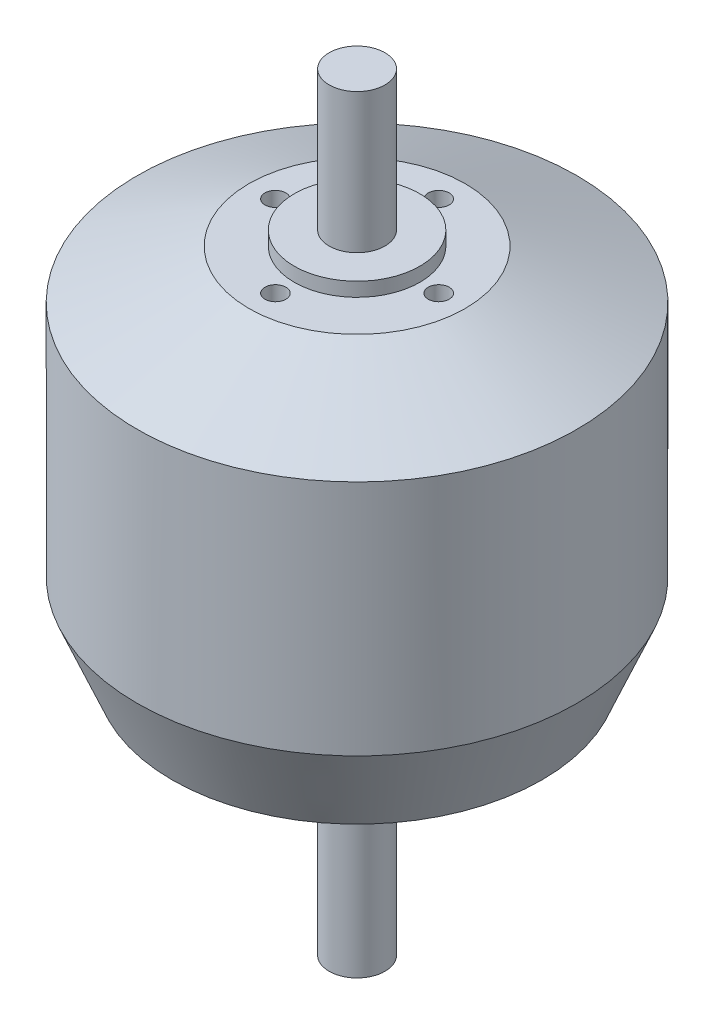
ISO-10303-21;
HEADER;
FILE_DESCRIPTION(('STEP AP214'),'2;1');
FILE_NAME('part.step','',(''),(''),'','','');
FILE_SCHEMA(('AUTOMOTIVE_DESIGN { 1 0 10303 214 1 1 1 1 }'));
ENDSEC;
DATA;
#1=APPLICATION_CONTEXT('core data for automotive mechanical design processes');
#2=APPLICATION_PROTOCOL_DEFINITION('international standard','automotive_design',2000,#1);
#3=PRODUCT_CONTEXT('',#1,'mechanical');
#4=PRODUCT('Part','Part','',(#3));
#5=PRODUCT_RELATED_PRODUCT_CATEGORY('part','',(#4));
#6=PRODUCT_DEFINITION_FORMATION('','',#4);
#7=PRODUCT_DEFINITION_CONTEXT('part definition',#1,'design');
#8=PRODUCT_DEFINITION('design','',#6,#7);
#9=PRODUCT_DEFINITION_SHAPE('','',#8);
#10=(LENGTH_UNIT() NAMED_UNIT(*) SI_UNIT(.MILLI.,.METRE.));
#11=(NAMED_UNIT(*) PLANE_ANGLE_UNIT() SI_UNIT($,.RADIAN.));
#12=(NAMED_UNIT(*) SI_UNIT($,.STERADIAN.) SOLID_ANGLE_UNIT());
#13=UNCERTAINTY_MEASURE_WITH_UNIT(LENGTH_MEASURE(1.E-05),#10,'distance_accuracy_value','');
#14=(GEOMETRIC_REPRESENTATION_CONTEXT(3) GLOBAL_UNCERTAINTY_ASSIGNED_CONTEXT((#13)) GLOBAL_UNIT_ASSIGNED_CONTEXT((#10,
#11,#12)) REPRESENTATION_CONTEXT('',''));
#15=CARTESIAN_POINT('',(0.,0.,0.));
#16=DIRECTION('',(0.,0.,1.));
#17=DIRECTION('',(1.,0.,0.));
#18=AXIS2_PLACEMENT_3D('',#15,#16,#17);
#19=CARTESIAN_POINT('',(0.,55.,0.));
#20=DIRECTION('',(0.,-1.,0.));
#21=DIRECTION('',(0.,0.,-1.));
#22=AXIS2_PLACEMENT_3D('',#19,#20,#21);
#23=CYLINDRICAL_SURFACE('',#22,31.5);
#24=CARTESIAN_POINT('',(0.,46.,0.));
#25=DIRECTION('',(0.,1.,0.));
#26=DIRECTION('',(0.,0.,1.));
#27=AXIS2_PLACEMENT_3D('',#24,#25,#26);
#28=CIRCLE('',#27,31.5);
#29=CARTESIAN_POINT('',(0.,46.,-31.5));
#30=VERTEX_POINT('',#29);
#31=EDGE_CURVE('E45',#30,#30,#28,.F.);
#32=ORIENTED_EDGE('',*,*,#31,.T.);
#33=EDGE_LOOP('',(#32));
#34=FACE_BOUND('',#33,.T.);
#35=CARTESIAN_POINT('',(0.,12.,0.));
#36=DIRECTION('',(0.,1.,0.));
#37=DIRECTION('',(0.,0.,1.));
#38=AXIS2_PLACEMENT_3D('',#35,#36,#37);
#39=CIRCLE('',#38,31.5);
#40=CARTESIAN_POINT('',(0.,12.,31.5));
#41=VERTEX_POINT('',#40);
#42=EDGE_CURVE('E115',#41,#41,#39,.T.);
#43=ORIENTED_EDGE('',*,*,#42,.T.);
#44=EDGE_LOOP('',(#43));
#45=FACE_BOUND('',#44,.T.);
#46=ADVANCED_FACE('F41',(#34,#45),#23,.T.);
#47=CARTESIAN_POINT('',(0.,0.,0.));
#48=DIRECTION('',(0.,1.,0.));
#49=DIRECTION('',(0.,0.,1.));
#50=AXIS2_PLACEMENT_3D('',#47,#48,#49);
#51=PLANE('',#50);
#52=CARTESIAN_POINT('',(0.,0.,0.));
#53=DIRECTION('',(0.,1.,0.));
#54=DIRECTION('',(0.,0.,1.));
#55=AXIS2_PLACEMENT_3D('',#52,#53,#54);
#56=CIRCLE('',#55,26.5);
#57=CARTESIAN_POINT('',(0.,0.,26.5));
#58=VERTEX_POINT('',#57);
#59=EDGE_CURVE('E120',#58,#58,#56,.F.);
#60=ORIENTED_EDGE('',*,*,#59,.T.);
#61=EDGE_LOOP('',(#60));
#62=FACE_BOUND('',#61,.T.);
#63=CARTESIAN_POINT('',(0.,0.,22.2));
#64=DIRECTION('',(0.,1.,0.));
#65=DIRECTION('',(0.,0.,1.));
#66=AXIS2_PLACEMENT_3D('',#63,#64,#65);
#67=CIRCLE('',#66,2.);
#68=CARTESIAN_POINT('',(0.,0.,24.2));
#69=VERTEX_POINT('',#68);
#70=EDGE_CURVE('E86',#69,#69,#67,.T.);
#71=ORIENTED_EDGE('',*,*,#70,.T.);
#72=EDGE_LOOP('',(#71));
#73=FACE_BOUND('',#72,.T.);
#74=CARTESIAN_POINT('',(-22.2,0.,0.));
#75=DIRECTION('',(0.,1.,0.));
#76=DIRECTION('',(0.,0.,1.));
#77=AXIS2_PLACEMENT_3D('',#74,#75,#76);
#78=CIRCLE('',#77,2.);
#79=CARTESIAN_POINT('',(-22.2,0.,2.));
#80=VERTEX_POINT('',#79);
#81=EDGE_CURVE('E92',#80,#80,#78,.T.);
#82=ORIENTED_EDGE('',*,*,#81,.T.);
#83=EDGE_LOOP('',(#82));
#84=FACE_BOUND('',#83,.T.);
#85=CARTESIAN_POINT('',(0.,0.,-22.2));
#86=DIRECTION('',(0.,1.,0.));
#87=DIRECTION('',(0.,0.,1.));
#88=AXIS2_PLACEMENT_3D('',#85,#86,#87);
#89=CIRCLE('',#88,2.);
#90=CARTESIAN_POINT('',(0.,0.,-20.2));
#91=VERTEX_POINT('',#90);
#92=EDGE_CURVE('E98',#91,#91,#89,.T.);
#93=ORIENTED_EDGE('',*,*,#92,.T.);
#94=EDGE_LOOP('',(#93));
#95=FACE_BOUND('',#94,.T.);
#96=CARTESIAN_POINT('',(22.2,0.,0.));
#97=DIRECTION('',(0.,1.,0.));
#98=DIRECTION('',(0.,0.,1.));
#99=AXIS2_PLACEMENT_3D('',#96,#97,#98);
#100=CIRCLE('',#99,2.);
#101=CARTESIAN_POINT('',(22.2,0.,2.));
#102=VERTEX_POINT('',#101);
#103=EDGE_CURVE('E60',#102,#102,#100,.T.);
#104=ORIENTED_EDGE('',*,*,#103,.T.);
#105=EDGE_LOOP('',(#104));
#106=FACE_BOUND('',#105,.T.);
#107=CARTESIAN_POINT('',(0.,0.,0.));
#108=DIRECTION('',(0.,1.,0.));
#109=DIRECTION('',(0.,0.,1.));
#110=AXIS2_PLACEMENT_3D('',#107,#108,#109);
#111=CIRCLE('',#110,4.);
#112=CARTESIAN_POINT('',(0.,0.,4.));
#113=VERTEX_POINT('',#112);
#114=EDGE_CURVE('E85',#113,#113,#111,.T.);
#115=ORIENTED_EDGE('',*,*,#114,.T.);
#116=EDGE_LOOP('',(#115));
#117=FACE_BOUND('',#116,.T.);
#118=ADVANCED_FACE('F143',(#62,#73,#84,#95,#106,#117),#51,.F.);
#119=CARTESIAN_POINT('',(0.,53.,0.));
#120=DIRECTION('',(0.,1.,0.));
#121=DIRECTION('',(0.,0.,1.));
#122=AXIS2_PLACEMENT_3D('',#119,#120,#121);
#123=PLANE('',#122);
#124=CARTESIAN_POINT('',(0.,53.,0.));
#125=DIRECTION('',(0.,1.,0.));
#126=DIRECTION('',(0.,0.,1.));
#127=AXIS2_PLACEMENT_3D('',#124,#125,#126);
#128=CIRCLE('',#127,15.4999999999998);
#129=CARTESIAN_POINT('',(0.,53.,-15.4999999999999));
#130=VERTEX_POINT('',#129);
#131=EDGE_CURVE('E53',#130,#130,#128,.T.);
#132=ORIENTED_EDGE('',*,*,#131,.T.);
#133=EDGE_LOOP('',(#132));
#134=FACE_BOUND('',#133,.T.);
#135=CARTESIAN_POINT('',(-11.7,53.,0.));
#136=DIRECTION('',(0.,1.,0.));
#137=DIRECTION('',(0.,0.,1.));
#138=AXIS2_PLACEMENT_3D('',#135,#136,#137);
#139=CIRCLE('',#138,1.5);
#140=CARTESIAN_POINT('',(-11.7,53.,1.5));
#141=VERTEX_POINT('',#140);
#142=EDGE_CURVE('E61',#141,#141,#139,.T.);
#143=ORIENTED_EDGE('',*,*,#142,.F.);
#144=EDGE_LOOP('',(#143));
#145=FACE_BOUND('',#144,.T.);
#146=CARTESIAN_POINT('',(0.,53.,-11.7));
#147=DIRECTION('',(0.,1.,0.));
#148=DIRECTION('',(0.,0.,1.));
#149=AXIS2_PLACEMENT_3D('',#146,#147,#148);
#150=CIRCLE('',#149,1.5);
#151=CARTESIAN_POINT('',(0.,53.,-10.2));
#152=VERTEX_POINT('',#151);
#153=EDGE_CURVE('E67',#152,#152,#150,.T.);
#154=ORIENTED_EDGE('',*,*,#153,.F.);
#155=EDGE_LOOP('',(#154));
#156=FACE_BOUND('',#155,.T.);
#157=CARTESIAN_POINT('',(11.7,53.,0.));
#158=DIRECTION('',(0.,1.,0.));
#159=DIRECTION('',(0.,0.,1.));
#160=AXIS2_PLACEMENT_3D('',#157,#158,#159);
#161=CIRCLE('',#160,1.5);
#162=CARTESIAN_POINT('',(11.7,53.,1.5));
#163=VERTEX_POINT('',#162);
#164=EDGE_CURVE('E73',#163,#163,#161,.T.);
#165=ORIENTED_EDGE('',*,*,#164,.F.);
#166=EDGE_LOOP('',(#165));
#167=FACE_BOUND('',#166,.T.);
#168=CARTESIAN_POINT('',(0.,53.,11.7));
#169=DIRECTION('',(0.,1.,0.));
#170=DIRECTION('',(0.,0.,1.));
#171=AXIS2_PLACEMENT_3D('',#168,#169,#170);
#172=CIRCLE('',#171,1.5);
#173=CARTESIAN_POINT('',(0.,53.,13.2));
#174=VERTEX_POINT('',#173);
#175=EDGE_CURVE('E79',#174,#174,#172,.T.);
#176=ORIENTED_EDGE('',*,*,#175,.F.);
#177=EDGE_LOOP('',(#176));
#178=FACE_BOUND('',#177,.T.);
#179=CARTESIAN_POINT('',(0.,53.,0.));
#180=DIRECTION('',(0.,1.,0.));
#181=DIRECTION('',(0.,0.,1.));
#182=AXIS2_PLACEMENT_3D('',#179,#180,#181);
#183=CIRCLE('',#182,9.);
#184=CARTESIAN_POINT('',(0.,53.,9.));
#185=VERTEX_POINT('',#184);
#186=EDGE_CURVE('E112',#185,#185,#183,.T.);
#187=ORIENTED_EDGE('',*,*,#186,.F.);
#188=EDGE_LOOP('',(#187));
#189=FACE_BOUND('',#188,.T.);
#190=ADVANCED_FACE('F125',(#134,#145,#156,#167,#178,#189),#123,.T.);
#191=CARTESIAN_POINT('',(0.,53.,0.));
#192=DIRECTION('',(0.,1.,0.));
#193=DIRECTION('',(0.,0.,1.));
#194=AXIS2_PLACEMENT_3D('',#191,#192,#193);
#195=CYLINDRICAL_SURFACE('',#194,9.);
#196=ORIENTED_EDGE('',*,*,#186,.T.);
#197=EDGE_LOOP('',(#196));
#198=FACE_BOUND('',#197,.T.);
#199=CARTESIAN_POINT('',(0.,55.,0.));
#200=DIRECTION('',(0.,1.,0.));
#201=DIRECTION('',(0.,0.,1.));
#202=AXIS2_PLACEMENT_3D('',#199,#200,#201);
#203=CIRCLE('',#202,9.);
#204=CARTESIAN_POINT('',(0.,55.,9.));
#205=VERTEX_POINT('',#204);
#206=EDGE_CURVE('E109',#205,#205,#203,.T.);
#207=ORIENTED_EDGE('',*,*,#206,.F.);
#208=EDGE_LOOP('',(#207));
#209=FACE_BOUND('',#208,.T.);
#210=ADVANCED_FACE('F157',(#198,#209),#195,.T.);
#211=CARTESIAN_POINT('',(0.,55.,0.));
#212=DIRECTION('',(0.,1.,0.));
#213=DIRECTION('',(0.,0.,1.));
#214=AXIS2_PLACEMENT_3D('',#211,#212,#213);
#215=PLANE('',#214);
#216=CARTESIAN_POINT('',(0.,55.,0.));
#217=DIRECTION('',(0.,1.,0.));
#218=DIRECTION('',(0.,0.,1.));
#219=AXIS2_PLACEMENT_3D('',#216,#217,#218);
#220=CIRCLE('',#219,4.);
#221=CARTESIAN_POINT('',(0.,55.,4.));
#222=VERTEX_POINT('',#221);
#223=EDGE_CURVE('E11',#222,#222,#220,.T.);
#224=ORIENTED_EDGE('',*,*,#223,.F.);
#225=EDGE_LOOP('',(#224));
#226=FACE_BOUND('',#225,.T.);
#227=ORIENTED_EDGE('',*,*,#206,.T.);
#228=EDGE_LOOP('',(#227));
#229=FACE_BOUND('',#228,.T.);
#230=ADVANCED_FACE('F153',(#226,#229),#215,.T.);
#231=CARTESIAN_POINT('',(0.,-35.,0.));
#232=DIRECTION('',(0.,1.,0.));
#233=DIRECTION('',(0.,0.,1.));
#234=AXIS2_PLACEMENT_3D('',#231,#232,#233);
#235=CYLINDRICAL_SURFACE('',#234,4.);
#236=CARTESIAN_POINT('',(0.,-35.,0.));
#237=DIRECTION('',(0.,1.,0.));
#238=DIRECTION('',(0.,0.,1.));
#239=AXIS2_PLACEMENT_3D('',#236,#237,#238);
#240=CIRCLE('',#239,4.);
#241=CARTESIAN_POINT('',(0.,-35.,4.));
#242=VERTEX_POINT('',#241);
#243=EDGE_CURVE('E106',#242,#242,#240,.T.);
#244=ORIENTED_EDGE('',*,*,#243,.T.);
#245=EDGE_LOOP('',(#244));
#246=FACE_BOUND('',#245,.T.);
#247=ORIENTED_EDGE('',*,*,#114,.F.);
#248=EDGE_LOOP('',(#247));
#249=FACE_BOUND('',#248,.T.);
#250=ADVANCED_FACE('F156',(#246,#249),#235,.T.);
#251=CARTESIAN_POINT('',(0.,-35.,0.));
#252=DIRECTION('',(0.,1.,0.));
#253=DIRECTION('',(0.,0.,1.));
#254=AXIS2_PLACEMENT_3D('',#251,#252,#253);
#255=PLANE('',#254);
#256=ORIENTED_EDGE('',*,*,#243,.F.);
#257=EDGE_LOOP('',(#256));
#258=FACE_BOUND('',#257,.T.);
#259=ADVANCED_FACE('F166',(#258),#255,.F.);
#260=CARTESIAN_POINT('',(22.2,10.,0.));
#261=DIRECTION('',(0.,-1.,0.));
#262=DIRECTION('',(0.,0.,-1.));
#263=AXIS2_PLACEMENT_3D('',#260,#261,#262);
#264=CYLINDRICAL_SURFACE('',#263,2.);
#265=CARTESIAN_POINT('',(22.2,10.,0.));
#266=DIRECTION('',(0.,1.,0.));
#267=DIRECTION('',(0.,0.,1.));
#268=AXIS2_PLACEMENT_3D('',#265,#266,#267);
#269=CIRCLE('',#268,2.);
#270=CARTESIAN_POINT('',(22.2,10.,2.));
#271=VERTEX_POINT('',#270);
#272=EDGE_CURVE('E101',#271,#271,#269,.T.);
#273=ORIENTED_EDGE('',*,*,#272,.T.);
#274=EDGE_LOOP('',(#273));
#275=FACE_BOUND('',#274,.T.);
#276=ORIENTED_EDGE('',*,*,#103,.F.);
#277=EDGE_LOOP('',(#276));
#278=FACE_BOUND('',#277,.T.);
#279=ADVANCED_FACE('F170',(#275,#278),#264,.F.);
#280=CARTESIAN_POINT('',(0.,10.,0.));
#281=DIRECTION('',(0.,1.,0.));
#282=DIRECTION('',(0.,0.,1.));
#283=AXIS2_PLACEMENT_3D('',#280,#281,#282);
#284=PLANE('',#283);
#285=ORIENTED_EDGE('',*,*,#272,.F.);
#286=EDGE_LOOP('',(#285));
#287=FACE_BOUND('',#286,.T.);
#288=ADVANCED_FACE('F174',(#287),#284,.F.);
#289=CARTESIAN_POINT('',(0.,10.,-22.2));
#290=DIRECTION('',(0.,-1.,0.));
#291=DIRECTION('',(0.,0.,-1.));
#292=AXIS2_PLACEMENT_3D('',#289,#290,#291);
#293=CYLINDRICAL_SURFACE('',#292,2.);
#294=CARTESIAN_POINT('',(0.,10.,-22.2));
#295=DIRECTION('',(0.,1.,0.));
#296=DIRECTION('',(0.,0.,1.));
#297=AXIS2_PLACEMENT_3D('',#294,#295,#296);
#298=CIRCLE('',#297,2.);
#299=CARTESIAN_POINT('',(0.,10.,-20.2));
#300=VERTEX_POINT('',#299);
#301=EDGE_CURVE('E95',#300,#300,#298,.T.);
#302=ORIENTED_EDGE('',*,*,#301,.T.);
#303=EDGE_LOOP('',(#302));
#304=FACE_BOUND('',#303,.T.);
#305=ORIENTED_EDGE('',*,*,#92,.F.);
#306=EDGE_LOOP('',(#305));
#307=FACE_BOUND('',#306,.T.);
#308=ADVANCED_FACE('F178',(#304,#307),#293,.F.);
#309=CARTESIAN_POINT('',(0.,10.,0.));
#310=DIRECTION('',(0.,1.,0.));
#311=DIRECTION('',(0.,0.,1.));
#312=AXIS2_PLACEMENT_3D('',#309,#310,#311);
#313=PLANE('',#312);
#314=ORIENTED_EDGE('',*,*,#301,.F.);
#315=EDGE_LOOP('',(#314));
#316=FACE_BOUND('',#315,.T.);
#317=ADVANCED_FACE('F182',(#316),#313,.F.);
#318=CARTESIAN_POINT('',(-22.2,10.,0.));
#319=DIRECTION('',(0.,-1.,0.));
#320=DIRECTION('',(0.,0.,-1.));
#321=AXIS2_PLACEMENT_3D('',#318,#319,#320);
#322=CYLINDRICAL_SURFACE('',#321,2.);
#323=CARTESIAN_POINT('',(-22.2,10.,0.));
#324=DIRECTION('',(0.,1.,0.));
#325=DIRECTION('',(0.,0.,1.));
#326=AXIS2_PLACEMENT_3D('',#323,#324,#325);
#327=CIRCLE('',#326,2.);
#328=CARTESIAN_POINT('',(-22.2,10.,2.));
#329=VERTEX_POINT('',#328);
#330=EDGE_CURVE('E89',#329,#329,#327,.T.);
#331=ORIENTED_EDGE('',*,*,#330,.T.);
#332=EDGE_LOOP('',(#331));
#333=FACE_BOUND('',#332,.T.);
#334=ORIENTED_EDGE('',*,*,#81,.F.);
#335=EDGE_LOOP('',(#334));
#336=FACE_BOUND('',#335,.T.);
#337=ADVANCED_FACE('F186',(#333,#336),#322,.F.);
#338=CARTESIAN_POINT('',(0.,10.,0.));
#339=DIRECTION('',(0.,1.,0.));
#340=DIRECTION('',(0.,0.,1.));
#341=AXIS2_PLACEMENT_3D('',#338,#339,#340);
#342=PLANE('',#341);
#343=ORIENTED_EDGE('',*,*,#330,.F.);
#344=EDGE_LOOP('',(#343));
#345=FACE_BOUND('',#344,.T.);
#346=ADVANCED_FACE('F190',(#345),#342,.F.);
#347=CARTESIAN_POINT('',(0.,10.,22.2));
#348=DIRECTION('',(0.,-1.,0.));
#349=DIRECTION('',(0.,0.,-1.));
#350=AXIS2_PLACEMENT_3D('',#347,#348,#349);
#351=CYLINDRICAL_SURFACE('',#350,2.);
#352=CARTESIAN_POINT('',(0.,10.,22.2));
#353=DIRECTION('',(0.,1.,0.));
#354=DIRECTION('',(0.,0.,1.));
#355=AXIS2_PLACEMENT_3D('',#352,#353,#354);
#356=CIRCLE('',#355,2.);
#357=CARTESIAN_POINT('',(0.,10.,24.2));
#358=VERTEX_POINT('',#357);
#359=EDGE_CURVE('E82',#358,#358,#356,.T.);
#360=ORIENTED_EDGE('',*,*,#359,.T.);
#361=EDGE_LOOP('',(#360));
#362=FACE_BOUND('',#361,.T.);
#363=ORIENTED_EDGE('',*,*,#70,.F.);
#364=EDGE_LOOP('',(#363));
#365=FACE_BOUND('',#364,.T.);
#366=ADVANCED_FACE('F194',(#362,#365),#351,.F.);
#367=CARTESIAN_POINT('',(0.,10.,0.));
#368=DIRECTION('',(0.,1.,0.));
#369=DIRECTION('',(0.,0.,1.));
#370=AXIS2_PLACEMENT_3D('',#367,#368,#369);
#371=PLANE('',#370);
#372=ORIENTED_EDGE('',*,*,#359,.F.);
#373=EDGE_LOOP('',(#372));
#374=FACE_BOUND('',#373,.T.);
#375=ADVANCED_FACE('F198',(#374),#371,.F.);
#376=CARTESIAN_POINT('',(0.,48.,11.7));
#377=DIRECTION('',(0.,1.,0.));
#378=DIRECTION('',(0.,0.,1.));
#379=AXIS2_PLACEMENT_3D('',#376,#377,#378);
#380=CYLINDRICAL_SURFACE('',#379,1.5);
#381=CARTESIAN_POINT('',(0.,48.,11.7));
#382=DIRECTION('',(0.,1.,0.));
#383=DIRECTION('',(0.,0.,1.));
#384=AXIS2_PLACEMENT_3D('',#381,#382,#383);
#385=CIRCLE('',#384,1.5);
#386=CARTESIAN_POINT('',(0.,48.,13.2));
#387=VERTEX_POINT('',#386);
#388=EDGE_CURVE('E76',#387,#387,#385,.T.);
#389=ORIENTED_EDGE('',*,*,#388,.F.);
#390=EDGE_LOOP('',(#389));
#391=FACE_BOUND('',#390,.T.);
#392=ORIENTED_EDGE('',*,*,#175,.T.);
#393=EDGE_LOOP('',(#392));
#394=FACE_BOUND('',#393,.T.);
#395=ADVANCED_FACE('F202',(#391,#394),#380,.F.);
#396=CARTESIAN_POINT('',(0.,48.,11.7));
#397=DIRECTION('',(0.,1.,0.));
#398=DIRECTION('',(0.,0.,1.));
#399=AXIS2_PLACEMENT_3D('',#396,#397,#398);
#400=PLANE('',#399);
#401=ORIENTED_EDGE('',*,*,#388,.T.);
#402=EDGE_LOOP('',(#401));
#403=FACE_BOUND('',#402,.T.);
#404=ADVANCED_FACE('F206',(#403),#400,.T.);
#405=CARTESIAN_POINT('',(11.7,48.,0.));
#406=DIRECTION('',(0.,1.,0.));
#407=DIRECTION('',(0.,0.,1.));
#408=AXIS2_PLACEMENT_3D('',#405,#406,#407);
#409=CYLINDRICAL_SURFACE('',#408,1.5);
#410=CARTESIAN_POINT('',(11.7,48.,0.));
#411=DIRECTION('',(0.,1.,0.));
#412=DIRECTION('',(0.,0.,1.));
#413=AXIS2_PLACEMENT_3D('',#410,#411,#412);
#414=CIRCLE('',#413,1.5);
#415=CARTESIAN_POINT('',(11.7,48.,1.5));
#416=VERTEX_POINT('',#415);
#417=EDGE_CURVE('E70',#416,#416,#414,.T.);
#418=ORIENTED_EDGE('',*,*,#417,.F.);
#419=EDGE_LOOP('',(#418));
#420=FACE_BOUND('',#419,.T.);
#421=ORIENTED_EDGE('',*,*,#164,.T.);
#422=EDGE_LOOP('',(#421));
#423=FACE_BOUND('',#422,.T.);
#424=ADVANCED_FACE('F210',(#420,#423),#409,.F.);
#425=CARTESIAN_POINT('',(11.7,48.,0.));
#426=DIRECTION('',(0.,1.,0.));
#427=DIRECTION('',(0.,0.,1.));
#428=AXIS2_PLACEMENT_3D('',#425,#426,#427);
#429=PLANE('',#428);
#430=ORIENTED_EDGE('',*,*,#417,.T.);
#431=EDGE_LOOP('',(#430));
#432=FACE_BOUND('',#431,.T.);
#433=ADVANCED_FACE('F214',(#432),#429,.T.);
#434=CARTESIAN_POINT('',(0.,48.,-11.7));
#435=DIRECTION('',(0.,1.,0.));
#436=DIRECTION('',(0.,0.,1.));
#437=AXIS2_PLACEMENT_3D('',#434,#435,#436);
#438=CYLINDRICAL_SURFACE('',#437,1.5);
#439=CARTESIAN_POINT('',(0.,48.,-11.7));
#440=DIRECTION('',(0.,1.,0.));
#441=DIRECTION('',(0.,0.,1.));
#442=AXIS2_PLACEMENT_3D('',#439,#440,#441);
#443=CIRCLE('',#442,1.5);
#444=CARTESIAN_POINT('',(0.,48.,-10.2));
#445=VERTEX_POINT('',#444);
#446=EDGE_CURVE('E64',#445,#445,#443,.T.);
#447=ORIENTED_EDGE('',*,*,#446,.F.);
#448=EDGE_LOOP('',(#447));
#449=FACE_BOUND('',#448,.T.);
#450=ORIENTED_EDGE('',*,*,#153,.T.);
#451=EDGE_LOOP('',(#450));
#452=FACE_BOUND('',#451,.T.);
#453=ADVANCED_FACE('F218',(#449,#452),#438,.F.);
#454=CARTESIAN_POINT('',(0.,48.,-11.7));
#455=DIRECTION('',(0.,1.,0.));
#456=DIRECTION('',(0.,0.,1.));
#457=AXIS2_PLACEMENT_3D('',#454,#455,#456);
#458=PLANE('',#457);
#459=ORIENTED_EDGE('',*,*,#446,.T.);
#460=EDGE_LOOP('',(#459));
#461=FACE_BOUND('',#460,.T.);
#462=ADVANCED_FACE('F222',(#461),#458,.T.);
#463=CARTESIAN_POINT('',(-11.7,48.,0.));
#464=DIRECTION('',(0.,1.,0.));
#465=DIRECTION('',(0.,0.,1.));
#466=AXIS2_PLACEMENT_3D('',#463,#464,#465);
#467=CYLINDRICAL_SURFACE('',#466,1.5);
#468=CARTESIAN_POINT('',(-11.7,48.,0.));
#469=DIRECTION('',(0.,1.,0.));
#470=DIRECTION('',(0.,0.,1.));
#471=AXIS2_PLACEMENT_3D('',#468,#469,#470);
#472=CIRCLE('',#471,1.5);
#473=CARTESIAN_POINT('',(-11.7,48.,1.5));
#474=VERTEX_POINT('',#473);
#475=EDGE_CURVE('E57',#474,#474,#472,.T.);
#476=ORIENTED_EDGE('',*,*,#475,.F.);
#477=EDGE_LOOP('',(#476));
#478=FACE_BOUND('',#477,.T.);
#479=ORIENTED_EDGE('',*,*,#142,.T.);
#480=EDGE_LOOP('',(#479));
#481=FACE_BOUND('',#480,.T.);
#482=ADVANCED_FACE('F226',(#478,#481),#467,.F.);
#483=CARTESIAN_POINT('',(-11.7,48.,0.));
#484=DIRECTION('',(0.,1.,0.));
#485=DIRECTION('',(0.,0.,1.));
#486=AXIS2_PLACEMENT_3D('',#483,#484,#485);
#487=PLANE('',#486);
#488=ORIENTED_EDGE('',*,*,#475,.T.);
#489=EDGE_LOOP('',(#488));
#490=FACE_BOUND('',#489,.T.);
#491=ADVANCED_FACE('F139',(#490),#487,.T.);
#492=CARTESIAN_POINT('',(0.,12.,0.));
#493=DIRECTION('',(0.,1.,0.));
#494=DIRECTION('',(0.,0.,1.));
#495=AXIS2_PLACEMENT_3D('',#492,#493,#494);
#496=CONICAL_SURFACE('',#495,31.5,0.394791119699759);
#497=ORIENTED_EDGE('',*,*,#59,.F.);
#498=EDGE_LOOP('',(#497));
#499=FACE_BOUND('',#498,.T.);
#500=ORIENTED_EDGE('',*,*,#42,.F.);
#501=EDGE_LOOP('',(#500));
#502=FACE_BOUND('',#501,.T.);
#503=ADVANCED_FACE('F130',(#499,#502),#496,.T.);
#504=CARTESIAN_POINT('',(0.,53.,0.));
#505=DIRECTION('',(0.,-1.,0.));
#506=DIRECTION('',(0.,0.,-1.));
#507=AXIS2_PLACEMENT_3D('',#504,#505,#506);
#508=CONICAL_SURFACE('',#507,15.4999999999998,1.15838588519751);
#509=CARTESIAN_POINT('',(0.,46.,-31.5));
#510=CARTESIAN_POINT('',(0.,46.0729166666666,-31.3333333333333));
#511=CARTESIAN_POINT('',(0.,46.1458333333333,-31.1666666666667));
#512=CARTESIAN_POINT('',(0.,46.2916666666666,-30.8333333333333));
#513=CARTESIAN_POINT('',(0.,46.3645833333333,-30.6666666666667));
#514=CARTESIAN_POINT('',(0.,46.5104166666666,-30.3333333333333));
#515=CARTESIAN_POINT('',(0.,46.5833333333333,-30.1666666666667));
#516=CARTESIAN_POINT('',(0.,46.7291666666666,-29.8333333333333));
#517=CARTESIAN_POINT('',(0.,46.8020833333333,-29.6666666666667));
#518=CARTESIAN_POINT('',(0.,46.9479166666666,-29.3333333333333));
#519=CARTESIAN_POINT('',(0.,47.0208333333333,-29.1666666666667));
#520=CARTESIAN_POINT('',(0.,47.1666666666666,-28.8333333333333));
#521=CARTESIAN_POINT('',(0.,47.2395833333333,-28.6666666666667));
#522=CARTESIAN_POINT('',(0.,47.3854166666666,-28.3333333333333));
#523=CARTESIAN_POINT('',(0.,47.4583333333333,-28.1666666666666));
#524=CARTESIAN_POINT('',(0.,47.6041666666667,-27.8333333333333));
#525=CARTESIAN_POINT('',(0.,47.6770833333333,-27.6666666666666));
#526=CARTESIAN_POINT('',(0.,47.8229166666666,-27.3333333333333));
#527=CARTESIAN_POINT('',(0.,47.8958333333333,-27.1666666666666));
#528=CARTESIAN_POINT('',(0.,48.0416666666667,-26.8333333333333));
#529=CARTESIAN_POINT('',(0.,48.1145833333333,-26.6666666666666));
#530=CARTESIAN_POINT('',(0.,48.2604166666666,-26.3333333333333));
#531=CARTESIAN_POINT('',(0.,48.3333333333333,-26.1666666666666));
#532=CARTESIAN_POINT('',(0.,48.4791666666667,-25.8333333333333));
#533=CARTESIAN_POINT('',(0.,48.5520833333333,-25.6666666666666));
#534=CARTESIAN_POINT('',(0.,48.6979166666666,-25.3333333333333));
#535=CARTESIAN_POINT('',(0.,48.7708333333333,-25.1666666666666));
#536=CARTESIAN_POINT('',(0.,48.9166666666667,-24.8333333333333));
#537=CARTESIAN_POINT('',(0.,48.9895833333333,-24.6666666666666));
#538=CARTESIAN_POINT('',(0.,49.1354166666667,-24.3333333333333));
#539=CARTESIAN_POINT('',(0.,49.2083333333333,-24.1666666666666));
#540=CARTESIAN_POINT('',(0.,49.3541666666667,-23.8333333333333));
#541=CARTESIAN_POINT('',(0.,49.4270833333333,-23.6666666666666));
#542=CARTESIAN_POINT('',(0.,49.5729166666667,-23.3333333333333));
#543=CARTESIAN_POINT('',(0.,49.6458333333333,-23.1666666666666));
#544=CARTESIAN_POINT('',(0.,49.7916666666667,-22.8333333333333));
#545=CARTESIAN_POINT('',(0.,49.8645833333333,-22.6666666666666));
#546=CARTESIAN_POINT('',(0.,50.0104166666667,-22.3333333333333));
#547=CARTESIAN_POINT('',(0.,50.0833333333333,-22.1666666666666));
#548=CARTESIAN_POINT('',(0.,50.2291666666667,-21.8333333333332));
#549=CARTESIAN_POINT('',(0.,50.3020833333333,-21.6666666666666));
#550=CARTESIAN_POINT('',(0.,50.4479166666667,-21.3333333333332));
#551=CARTESIAN_POINT('',(0.,50.5208333333333,-21.1666666666666));
#552=CARTESIAN_POINT('',(0.,50.6666666666667,-20.8333333333332));
#553=CARTESIAN_POINT('',(0.,50.7395833333333,-20.6666666666666));
#554=CARTESIAN_POINT('',(0.,50.8854166666667,-20.3333333333332));
#555=CARTESIAN_POINT('',(0.,50.9583333333333,-20.1666666666666));
#556=CARTESIAN_POINT('',(0.,51.1041666666667,-19.8333333333332));
#557=CARTESIAN_POINT('',(0.,51.1770833333333,-19.6666666666666));
#558=CARTESIAN_POINT('',(0.,51.3229166666667,-19.3333333333332));
#559=CARTESIAN_POINT('',(0.,51.3958333333333,-19.1666666666666));
#560=CARTESIAN_POINT('',(0.,51.5416666666667,-18.8333333333332));
#561=CARTESIAN_POINT('',(0.,51.6145833333333,-18.6666666666666));
#562=CARTESIAN_POINT('',(0.,51.7604166666667,-18.3333333333332));
#563=CARTESIAN_POINT('',(0.,51.8333333333333,-18.1666666666665));
#564=CARTESIAN_POINT('',(0.,51.9791666666667,-17.8333333333332));
#565=CARTESIAN_POINT('',(0.,52.0520833333333,-17.6666666666665));
#566=CARTESIAN_POINT('',(0.,52.1979166666667,-17.3333333333332));
#567=CARTESIAN_POINT('',(0.,52.2708333333333,-17.1666666666665));
#568=CARTESIAN_POINT('',(0.,52.4166666666667,-16.8333333333332));
#569=CARTESIAN_POINT('',(0.,52.4895833333333,-16.6666666666665));
#570=CARTESIAN_POINT('',(0.,52.6354166666667,-16.3333333333332));
#571=CARTESIAN_POINT('',(0.,52.7083333333333,-16.1666666666665));
#572=CARTESIAN_POINT('',(0.,52.8541666666667,-15.8333333333332));
#573=CARTESIAN_POINT('',(0.,52.9270833333333,-15.6666666666665));
#574=CARTESIAN_POINT('',(0.,53.,-15.4999999999999));
#575=B_SPLINE_CURVE_WITH_KNOTS('',3,(#509,#510,#511,#512,#513,#514,#515,#516,#517,#518,#519,
#520,#521,#522,#523,#524,#525,#526,#527,#528,#529,#530,#531,#532,#533,#534,#535,#536,#537,#538,
#539,#540,#541,#542,#543,#544,#545,#546,#547,#548,#549,#550,#551,#552,#553,#554,#555,#556,#557,
#558,#559,#560,#561,#562,#563,#564,#565,#566,#567,#568,#569,#570,#571,#572,#573,#574),
.UNSPECIFIED.,.F.,.F.,(4,2,2,2,2,2,2,2,2,2,2,2,2,2,2,2,2,2,2,2,2,2,2,2,2,2,2,2,2,2,2,2,4),(0.,
0.545757787392911,1.09151557478582,1.63727336217874,2.18303114957164,2.72878893696455,
3.27454672435747,3.82030451175038,4.36606229914329,4.91182008653619,5.45757787392911,
6.00333566132202,6.54909344871492,7.09485123610784,7.64060902350075,8.18636681089366,
8.73212459828657,9.27788238567948,9.82364017307239,10.3693979604653,10.9151557478582,
11.4609135352511,12.006671322644,12.5524291100369,13.0981868974299,13.6439446848228,
14.1897024722157,14.7354602596086,15.2812180470015,15.8269758343944,16.3727336217873,
16.9184914091802,17.4642491965731),.UNSPECIFIED.);
#576=EDGE_CURVE('BSEAM43',#30,#130,#575,.T.);
#577=ORIENTED_EDGE('',*,*,#31,.F.);
#578=ORIENTED_EDGE('',*,*,#131,.F.);
#579=ORIENTED_EDGE('',*,*,#576,.T.);
#580=ORIENTED_EDGE('',*,*,#576,.F.);
#581=EDGE_LOOP('',(#577,#579,#578,#580));
#582=FACE_BOUND('',#581,.T.);
#583=ADVANCED_FACE('F43',(#582),#508,.T.);
#584=CARTESIAN_POINT('',(0.,75.,0.));
#585=DIRECTION('',(0.,-1.,0.));
#586=DIRECTION('',(0.,0.,-1.));
#587=AXIS2_PLACEMENT_3D('',#584,#585,#586);
#588=CYLINDRICAL_SURFACE('',#587,4.);
#589=CARTESIAN_POINT('',(0.,75.,0.));
#590=DIRECTION('',(0.,1.,0.));
#591=DIRECTION('',(0.,0.,1.));
#592=AXIS2_PLACEMENT_3D('',#589,#590,#591);
#593=CIRCLE('',#592,4.);
#594=CARTESIAN_POINT('',(0.,75.,4.));
#595=VERTEX_POINT('',#594);
#596=EDGE_CURVE('E56',#595,#595,#593,.T.);
#597=ORIENTED_EDGE('',*,*,#596,.F.);
#598=EDGE_LOOP('',(#597));
#599=FACE_BOUND('',#598,.T.);
#600=ORIENTED_EDGE('',*,*,#223,.T.);
#601=EDGE_LOOP('',(#600));
#602=FACE_BOUND('',#601,.T.);
#603=ADVANCED_FACE('F129',(#599,#602),#588,.T.);
#604=CARTESIAN_POINT('',(0.,75.,0.));
#605=DIRECTION('',(0.,1.,0.));
#606=DIRECTION('',(0.,0.,1.));
#607=AXIS2_PLACEMENT_3D('',#604,#605,#606);
#608=PLANE('',#607);
#609=ORIENTED_EDGE('',*,*,#596,.T.);
#610=EDGE_LOOP('',(#609));
#611=FACE_BOUND('',#610,.T.);
#612=ADVANCED_FACE('F136',(#611),#608,.T.);
#613=CLOSED_SHELL('',(#46,#118,#190,#210,#230,#250,#259,#279,#288,#308,#317,#337,#346,#366,#375,
#395,#404,#424,#433,#453,#462,#482,#491,#503,#583,#603,#612));
#614=MANIFOLD_SOLID_BREP('B2',#613);
#615=ADVANCED_BREP_SHAPE_REPRESENTATION('',(#18,#614),#14);
#616=SHAPE_DEFINITION_REPRESENTATION(#9,#615);
ENDSEC;
END-ISO-10303-21;
